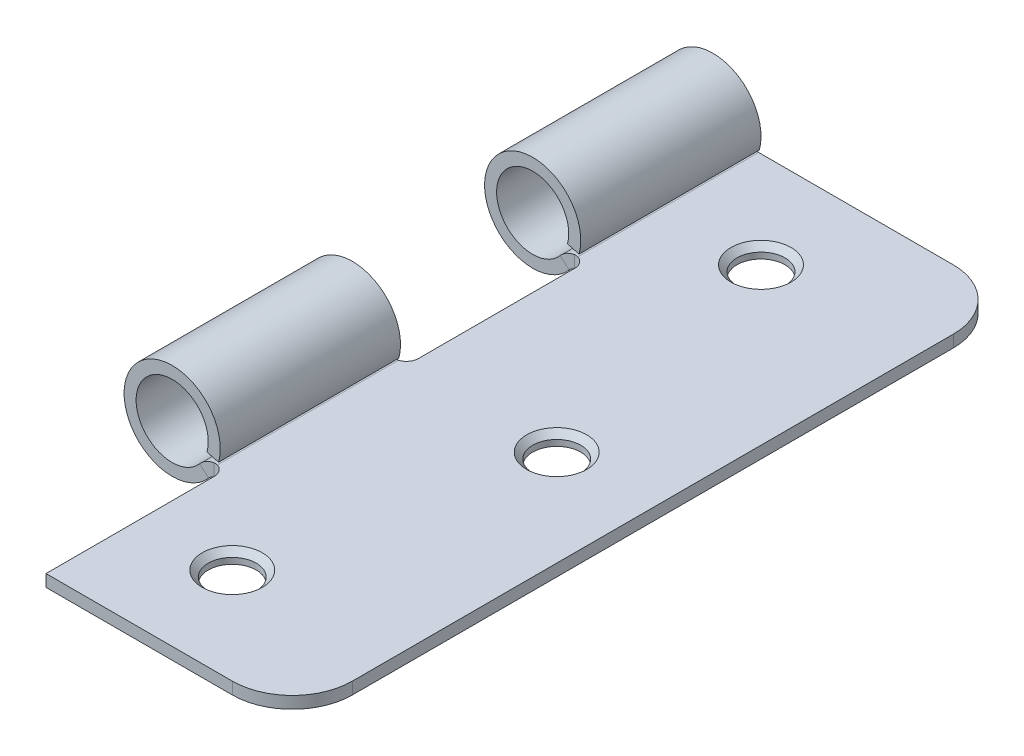
ISO-10303-21;
HEADER;
FILE_DESCRIPTION(('STEP AP214'),'2;1');
FILE_NAME('part.step','',(''),(''),'','','');
FILE_SCHEMA(('AUTOMOTIVE_DESIGN { 1 0 10303 214 1 1 1 1 }'));
ENDSEC;
DATA;
#1=APPLICATION_CONTEXT('core data for automotive mechanical design processes');
#2=APPLICATION_PROTOCOL_DEFINITION('international standard','automotive_design',2000,#1);
#3=PRODUCT_CONTEXT('',#1,'mechanical');
#4=PRODUCT('Part','Part','',(#3));
#5=PRODUCT_RELATED_PRODUCT_CATEGORY('part','',(#4));
#6=PRODUCT_DEFINITION_FORMATION('','',#4);
#7=PRODUCT_DEFINITION_CONTEXT('part definition',#1,'design');
#8=PRODUCT_DEFINITION('design','',#6,#7);
#9=PRODUCT_DEFINITION_SHAPE('','',#8);
#10=(LENGTH_UNIT() NAMED_UNIT(*) SI_UNIT(.MILLI.,.METRE.));
#11=(NAMED_UNIT(*) PLANE_ANGLE_UNIT() SI_UNIT($,.RADIAN.));
#12=(NAMED_UNIT(*) SI_UNIT($,.STERADIAN.) SOLID_ANGLE_UNIT());
#13=UNCERTAINTY_MEASURE_WITH_UNIT(LENGTH_MEASURE(1.E-05),#10,'distance_accuracy_value','');
#14=(GEOMETRIC_REPRESENTATION_CONTEXT(3) GLOBAL_UNCERTAINTY_ASSIGNED_CONTEXT((#13)) GLOBAL_UNIT_ASSIGNED_CONTEXT((#10,
#11,#12)) REPRESENTATION_CONTEXT('',''));
#15=CARTESIAN_POINT('',(0.,0.,0.));
#16=DIRECTION('',(0.,0.,1.));
#17=DIRECTION('',(1.,0.,0.));
#18=AXIS2_PLACEMENT_3D('',#15,#16,#17);
#19=CARTESIAN_POINT('',(-4.,4.,-15.));
#20=DIRECTION('',(0.,0.,-1.));
#21=DIRECTION('',(-1.,0.,0.));
#22=AXIS2_PLACEMENT_3D('',#19,#20,#21);
#23=PLANE('',#22);
#24=CARTESIAN_POINT('',(0.,0.,-15.));
#25=DIRECTION('',(0.,0.,-1.));
#26=DIRECTION('',(-1.,0.,0.));
#27=AXIS2_PLACEMENT_3D('',#24,#25,#26);
#28=CIRCLE('',#27,4.);
#29=CARTESIAN_POINT('',(3.03973683071413,-2.6,-15.));
#30=VERTEX_POINT('',#29);
#31=CARTESIAN_POINT('',(3.85972796968906,-1.05,-15.));
#32=VERTEX_POINT('',#31);
#33=EDGE_CURVE('E525',#30,#32,#28,.T.);
#34=ORIENTED_EDGE('',*,*,#33,.F.);
#35=DIRECTION('',(-0.759934207678533,0.65,0.));
#36=VECTOR('',#35,1.);
#37=CARTESIAN_POINT('',(3.03973683071413,-2.6,-15.));
#38=LINE('',#37,#36);
#39=CARTESIAN_POINT('',(2.2798026230356,-1.95,-15.));
#40=VERTEX_POINT('',#39);
#41=EDGE_CURVE('E290',#30,#40,#38,.T.);
#42=ORIENTED_EDGE('',*,*,#41,.T.);
#43=CARTESIAN_POINT('',(0.,0.,-15.));
#44=DIRECTION('',(0.,0.,-1.));
#45=DIRECTION('',(-1.,0.,0.));
#46=AXIS2_PLACEMENT_3D('',#43,#44,#45);
#47=CIRCLE('',#46,3.);
#48=CARTESIAN_POINT('',(2.89479597726679,-0.787500000000001,-15.));
#49=VERTEX_POINT('',#48);
#50=EDGE_CURVE('E474',#40,#49,#47,.T.);
#51=ORIENTED_EDGE('',*,*,#50,.T.);
#52=DIRECTION('',(0.964931992422264,-0.2625,0.));
#53=VECTOR('',#52,1.);
#54=CARTESIAN_POINT('',(3.85972796968906,-1.05,-15.));
#55=LINE('',#54,#53);
#56=EDGE_CURVE('E479',#49,#32,#55,.T.);
#57=ORIENTED_EDGE('',*,*,#56,.T.);
#58=EDGE_LOOP('',(#34,#42,#51,#57));
#59=FACE_BOUND('',#58,.T.);
#60=ADVANCED_FACE('F42',(#59),#23,.F.);
#61=CARTESIAN_POINT('',(-4.,4.,0.));
#62=DIRECTION('',(0.,0.,1.));
#63=DIRECTION('',(1.,0.,0.));
#64=AXIS2_PLACEMENT_3D('',#61,#62,#63);
#65=PLANE('',#64);
#66=CARTESIAN_POINT('',(0.,0.,0.));
#67=DIRECTION('',(0.,0.,1.));
#68=DIRECTION('',(1.,0.,0.));
#69=AXIS2_PLACEMENT_3D('',#66,#67,#68);
#70=CIRCLE('',#69,3.);
#71=CARTESIAN_POINT('',(2.89479597726679,-0.787500000000001,0.));
#72=VERTEX_POINT('',#71);
#73=CARTESIAN_POINT('',(2.2798026230356,-1.95,0.));
#74=VERTEX_POINT('',#73);
#75=EDGE_CURVE('E484',#72,#74,#70,.T.);
#76=ORIENTED_EDGE('',*,*,#75,.T.);
#77=DIRECTION('',(0.759934207678533,-0.650000000000001,0.));
#78=VECTOR('',#77,1.);
#79=CARTESIAN_POINT('',(2.2798026230356,-1.95,0.));
#80=LINE('',#79,#78);
#81=CARTESIAN_POINT('',(3.03973683071413,-2.6,0.));
#82=VERTEX_POINT('',#81);
#83=EDGE_CURVE('E288',#74,#82,#80,.T.);
#84=ORIENTED_EDGE('',*,*,#83,.T.);
#85=CARTESIAN_POINT('',(0.,0.,0.));
#86=DIRECTION('',(0.,0.,1.));
#87=DIRECTION('',(1.,0.,0.));
#88=AXIS2_PLACEMENT_3D('',#85,#86,#87);
#89=CIRCLE('',#88,4.);
#90=CARTESIAN_POINT('',(3.85972796968906,-1.05,0.));
#91=VERTEX_POINT('',#90);
#92=EDGE_CURVE('E473',#91,#82,#89,.T.);
#93=ORIENTED_EDGE('',*,*,#92,.F.);
#94=DIRECTION('',(-0.964931992422264,0.2625,0.));
#95=VECTOR('',#94,1.);
#96=CARTESIAN_POINT('',(3.85972796968906,-1.05,0.));
#97=LINE('',#96,#95);
#98=EDGE_CURVE('E477',#91,#72,#97,.T.);
#99=ORIENTED_EDGE('',*,*,#98,.T.);
#100=EDGE_LOOP('',(#76,#84,#93,#99));
#101=FACE_BOUND('',#100,.T.);
#102=ADVANCED_FACE('F440',(#101),#65,.F.);
#103=CARTESIAN_POINT('',(-4.,4.,15.));
#104=DIRECTION('',(0.,0.,-1.));
#105=DIRECTION('',(-1.,0.,0.));
#106=AXIS2_PLACEMENT_3D('',#103,#104,#105);
#107=PLANE('',#106);
#108=CARTESIAN_POINT('',(0.,0.,15.));
#109=DIRECTION('',(0.,0.,-1.));
#110=DIRECTION('',(-1.,0.,0.));
#111=AXIS2_PLACEMENT_3D('',#108,#109,#110);
#112=CIRCLE('',#111,4.);
#113=CARTESIAN_POINT('',(3.03973683071413,-2.6,15.));
#114=VERTEX_POINT('',#113);
#115=CARTESIAN_POINT('',(3.85972796968906,-1.05,15.));
#116=VERTEX_POINT('',#115);
#117=EDGE_CURVE('E514',#114,#116,#112,.T.);
#118=ORIENTED_EDGE('',*,*,#117,.F.);
#119=DIRECTION('',(-0.759934207678533,0.650000000000001,0.));
#120=VECTOR('',#119,1.);
#121=CARTESIAN_POINT('',(3.03973683071413,-2.6,15.));
#122=LINE('',#121,#120);
#123=CARTESIAN_POINT('',(2.2798026230356,-1.95,15.));
#124=VERTEX_POINT('',#123);
#125=EDGE_CURVE('E285',#114,#124,#122,.T.);
#126=ORIENTED_EDGE('',*,*,#125,.T.);
#127=CARTESIAN_POINT('',(0.,0.,15.));
#128=DIRECTION('',(0.,0.,-1.));
#129=DIRECTION('',(-1.,0.,0.));
#130=AXIS2_PLACEMENT_3D('',#127,#128,#129);
#131=CIRCLE('',#130,3.);
#132=CARTESIAN_POINT('',(2.89479597726679,-0.787500000000001,15.));
#133=VERTEX_POINT('',#132);
#134=EDGE_CURVE('E522',#124,#133,#131,.T.);
#135=ORIENTED_EDGE('',*,*,#134,.T.);
#136=DIRECTION('',(0.964931992422264,-0.2625,0.));
#137=VECTOR('',#136,1.);
#138=CARTESIAN_POINT('',(3.85972796968906,-1.05,15.));
#139=LINE('',#138,#137);
#140=EDGE_CURVE('E517',#133,#116,#139,.T.);
#141=ORIENTED_EDGE('',*,*,#140,.T.);
#142=EDGE_LOOP('',(#118,#126,#135,#141));
#143=FACE_BOUND('',#142,.T.);
#144=ADVANCED_FACE('F446',(#143),#107,.F.);
#145=CARTESIAN_POINT('',(3.79967103839267,-3.25,30.));
#146=DIRECTION('',(0.,0.,-1.));
#147=DIRECTION('',(-1.,0.,0.));
#148=AXIS2_PLACEMENT_3D('',#145,#146,#147);
#149=CYLINDRICAL_SURFACE('',#148,2.);
#150=CARTESIAN_POINT('',(3.79967103839267,-3.25,0.));
#151=DIRECTION('',(0.,0.,1.));
#152=DIRECTION('',(1.,0.,0.));
#153=AXIS2_PLACEMENT_3D('',#150,#151,#152);
#154=CIRCLE('',#153,2.);
#155=CARTESIAN_POINT('',(3.50000000000001,-1.27257812575347,0.));
#156=VERTEX_POINT('',#155);
#157=EDGE_CURVE('E487',#74,#156,#154,.F.);
#158=ORIENTED_EDGE('',*,*,#157,.F.);
#159=DIRECTION('',(0.,0.,-1.));
#160=VECTOR('',#159,1.);
#161=CARTESIAN_POINT('',(2.2798026230356,-1.95,30.));
#162=LINE('',#161,#160);
#163=EDGE_CURVE('E263',#124,#74,#162,.T.);
#164=ORIENTED_EDGE('',*,*,#163,.F.);
#165=CARTESIAN_POINT('',(3.79967103839267,-3.25,15.));
#166=DIRECTION('',(0.,0.,-1.));
#167=DIRECTION('',(-1.,0.,0.));
#168=AXIS2_PLACEMENT_3D('',#165,#166,#167);
#169=CIRCLE('',#168,2.);
#170=CARTESIAN_POINT('',(3.5,-1.27257812575347,15.));
#171=VERTEX_POINT('',#170);
#172=EDGE_CURVE('E511',#171,#124,#169,.F.);
#173=ORIENTED_EDGE('',*,*,#172,.F.);
#174=CARTESIAN_POINT('',(3.5,-1.27257812575347,15.));
#175=CARTESIAN_POINT('',(3.52525806966535,-1.26874628469074,14.9999961626462));
#176=CARTESIAN_POINT('',(3.55059157931103,-1.26540623348809,15.0009569814927));
#177=CARTESIAN_POINT('',(3.60104085996858,-1.25972821267769,15.0047993866077));
#178=CARTESIAN_POINT('',(3.62615689453804,-1.2573832611068,15.0076672149353));
#179=CARTESIAN_POINT('',(3.67616848193919,-1.25365934632331,15.0153149888024));
#180=CARTESIAN_POINT('',(3.70106403482151,-1.25228038288891,15.0200949339029));
#181=CARTESIAN_POINT('',(3.75063082715903,-1.25044549787901,15.0315796795409));
#182=CARTESIAN_POINT('',(3.7752991674899,-1.24999628314065,15.038298070478));
#183=CARTESIAN_POINT('',(3.79967103839267,-1.25,15.045957407267));
#184=B_SPLINE_CURVE_WITH_KNOTS('',3,(#174,#175,#176,#177,#178,#179,#180,#181,#182,#183),
.UNSPECIFIED.,.F.,.F.,(4,2,2,2,4),(0.,0.0766195222768499,0.152692191899362,0.228764844054566,
0.305384368144875),.UNSPECIFIED.);
#185=CARTESIAN_POINT('',(3.79967103839267,-1.25,15.0459574072667));
#186=VERTEX_POINT('',#185);
#187=EDGE_CURVE('E318',#171,#186,#184,.T.);
#188=ORIENTED_EDGE('',*,*,#187,.T.);
#189=DIRECTION('',(0.,0.,-1.));
#190=VECTOR('',#189,1.);
#191=CARTESIAN_POINT('',(3.79967103839267,-1.25,30.));
#192=LINE('',#191,#190);
#193=CARTESIAN_POINT('',(3.79967103839267,-1.25,-0.045957407266678));
#194=VERTEX_POINT('',#193);
#195=EDGE_CURVE('E266',#186,#194,#192,.T.);
#196=ORIENTED_EDGE('',*,*,#195,.T.);
#197=CARTESIAN_POINT('',(3.79967103839267,-1.25,-0.0459574072666771));
#198=CARTESIAN_POINT('',(3.77529916748986,-1.24999628314065,-0.0382980704778374));
#199=CARTESIAN_POINT('',(3.75063082715897,-1.25044549787902,-0.031579679540831));
#200=CARTESIAN_POINT('',(3.70106403482146,-1.25228038288891,-0.0200949339028791));
#201=CARTESIAN_POINT('',(3.67616848193916,-1.25365934632331,-0.0153149888023927));
#202=CARTESIAN_POINT('',(3.62615689453802,-1.2573832611068,-0.00766721493527763));
#203=CARTESIAN_POINT('',(3.60104085996856,-1.25972821267769,-0.00479938660769741));
#204=CARTESIAN_POINT('',(3.55059157931102,-1.2654062334881,-0.000956981492719929));
#205=CARTESIAN_POINT('',(3.52525806966535,-1.26874628469074,3.83735374171621E-06));
#206=CARTESIAN_POINT('',(3.50000000000001,-1.27257812575347,0.));
#207=B_SPLINE_CURVE_WITH_KNOTS('',3,(#197,#198,#199,#200,#201,#202,#203,#204,#205,#206),
.UNSPECIFIED.,.F.,.F.,(4,2,2,2,4),(0.,0.0766195240902687,0.152692176245446,0.228764845867951,
0.30538436814478),.UNSPECIFIED.);
#208=EDGE_CURVE('E356',#194,#156,#207,.T.);
#209=ORIENTED_EDGE('',*,*,#208,.T.);
#210=EDGE_LOOP('',(#158,#164,#173,#188,#196,#209));
#211=FACE_BOUND('',#210,.T.);
#212=ADVANCED_FACE('F373',(#211),#149,.T.);
#213=CARTESIAN_POINT('',(0.,0.,30.));
#214=DIRECTION('',(0.,0.,-1.));
#215=DIRECTION('',(-1.,0.,0.));
#216=AXIS2_PLACEMENT_3D('',#213,#214,#215);
#217=CYLINDRICAL_SURFACE('',#216,3.);
#218=ORIENTED_EDGE('',*,*,#75,.F.);
#219=DIRECTION('',(0.,0.,-1.));
#220=VECTOR('',#219,1.);
#221=CARTESIAN_POINT('',(2.89479597726679,-0.787500000000001,30.));
#222=LINE('',#221,#220);
#223=EDGE_CURVE('E260',#133,#72,#222,.T.);
#224=ORIENTED_EDGE('',*,*,#223,.F.);
#225=ORIENTED_EDGE('',*,*,#134,.F.);
#226=ORIENTED_EDGE('',*,*,#163,.T.);
#227=EDGE_LOOP('',(#218,#224,#225,#226));
#228=FACE_BOUND('',#227,.T.);
#229=ADVANCED_FACE('F667',(#228),#217,.F.);
#230=CARTESIAN_POINT('',(3.85972796968906,-1.05,30.));
#231=DIRECTION('',(-0.2625,-0.964931992422264,0.));
#232=DIRECTION('',(0.964931992422264,-0.2625,0.));
#233=AXIS2_PLACEMENT_3D('',#230,#231,#232);
#234=PLANE('',#233);
#235=ORIENTED_EDGE('',*,*,#98,.F.);
#236=DIRECTION('',(0.,0.,-1.));
#237=VECTOR('',#236,1.);
#238=CARTESIAN_POINT('',(3.85972796968906,-1.05,30.));
#239=LINE('',#238,#237);
#240=EDGE_CURVE('E257',#116,#91,#239,.T.);
#241=ORIENTED_EDGE('',*,*,#240,.F.);
#242=ORIENTED_EDGE('',*,*,#140,.F.);
#243=ORIENTED_EDGE('',*,*,#223,.T.);
#244=EDGE_LOOP('',(#235,#241,#242,#243));
#245=FACE_BOUND('',#244,.T.);
#246=ADVANCED_FACE('F677',(#245),#234,.T.);
#247=CARTESIAN_POINT('',(0.,0.,30.));
#248=DIRECTION('',(0.,0.,-1.));
#249=DIRECTION('',(-1.,0.,0.));
#250=AXIS2_PLACEMENT_3D('',#247,#248,#249);
#251=CYLINDRICAL_SURFACE('',#250,4.);
#252=DIRECTION('',(0.,0.,-1.));
#253=VECTOR('',#252,1.);
#254=CARTESIAN_POINT('',(3.03973683071413,-2.6,30.));
#255=LINE('',#254,#253);
#256=CARTESIAN_POINT('',(3.03973683071413,-2.6,-30.));
#257=VERTEX_POINT('',#256);
#258=EDGE_CURVE('E252',#30,#257,#255,.T.);
#259=ORIENTED_EDGE('',*,*,#258,.F.);
#260=ORIENTED_EDGE('',*,*,#33,.T.);
#261=CARTESIAN_POINT('',(3.85972796968906,-1.05,-30.));
#262=VERTEX_POINT('',#261);
#263=EDGE_CURVE('E255',#32,#262,#239,.T.);
#264=ORIENTED_EDGE('',*,*,#263,.T.);
#265=CARTESIAN_POINT('',(0.,0.,-30.));
#266=DIRECTION('',(0.,0.,1.));
#267=DIRECTION('',(1.,0.,0.));
#268=AXIS2_PLACEMENT_3D('',#265,#266,#267);
#269=CIRCLE('',#268,4.);
#270=EDGE_CURVE('E247',#262,#257,#269,.T.);
#271=ORIENTED_EDGE('',*,*,#270,.T.);
#272=EDGE_LOOP('',(#259,#260,#264,#271));
#273=FACE_BOUND('',#272,.T.);
#274=ADVANCED_FACE('F534',(#273),#251,.T.);
#275=ORIENTED_EDGE('',*,*,#240,.T.);
#276=ORIENTED_EDGE('',*,*,#92,.T.);
#277=EDGE_CURVE('E254',#114,#82,#255,.T.);
#278=ORIENTED_EDGE('',*,*,#277,.F.);
#279=ORIENTED_EDGE('',*,*,#117,.T.);
#280=EDGE_LOOP('',(#275,#276,#278,#279));
#281=FACE_BOUND('',#280,.T.);
#282=ADVANCED_FACE('F655',(#281),#251,.T.);
#283=CARTESIAN_POINT('',(3.79967103839267,-3.25,30.));
#284=DIRECTION('',(0.,0.,-1.));
#285=DIRECTION('',(-1.,0.,0.));
#286=AXIS2_PLACEMENT_3D('',#283,#284,#285);
#287=CYLINDRICAL_SURFACE('',#286,1.);
#288=ORIENTED_EDGE('',*,*,#277,.T.);
#289=CARTESIAN_POINT('',(3.79967103839267,-3.25,0.));
#290=DIRECTION('',(0.,0.,1.));
#291=DIRECTION('',(1.,0.,0.));
#292=AXIS2_PLACEMENT_3D('',#289,#290,#291);
#293=CIRCLE('',#292,1.);
#294=CARTESIAN_POINT('',(3.50000000000001,-2.29595740726702,0.));
#295=VERTEX_POINT('',#294);
#296=EDGE_CURVE('E279',#82,#295,#293,.F.);
#297=ORIENTED_EDGE('',*,*,#296,.T.);
#298=CARTESIAN_POINT('',(3.50000000000001,-2.29595740726702,0.));
#299=CARTESIAN_POINT('',(3.51957914919401,-2.28980655121241,5.89914558545269E-07));
#300=CARTESIAN_POINT('',(3.53933698416749,-2.28426454209161,-0.000576001277334713));
#301=CARTESIAN_POINT('',(3.57909764557699,-2.27441425109873,-0.00293376845682965));
#302=CARTESIAN_POINT('',(3.59910059644118,-2.27010662539284,-0.00471558342530537));
#303=CARTESIAN_POINT('',(3.65851730173643,-2.25920755965835,-0.0118521737425471));
#304=CARTESIAN_POINT('',(3.69809004691073,-2.25440637226324,-0.0189951866346676));
#305=CARTESIAN_POINT('',(3.74762406736527,-2.25129937223126,-0.0310829325965476));
#306=CARTESIAN_POINT('',(3.75806356134268,-2.2508114116661,-0.0338113479703317));
#307=CARTESIAN_POINT('',(3.77890856064359,-2.25016132900707,-0.0396215145788455));
#308=CARTESIAN_POINT('',(3.78931365697017,-2.25000079525633,-0.0427049119001406));
#309=CARTESIAN_POINT('',(3.79967103839259,-2.25,-0.0459574072669965));
#310=B_SPLINE_CURVE_WITH_KNOTS('',3,(#298,#299,#300,#301,#302,#303,#304,#305,#306,#307,#308,
#309),.UNSPECIFIED.,.F.,.F.,(4,2,2,2,2,4),(0.,0.061524461135212,0.123081566664696,
0.243864969400355,0.276263286736285,0.308818397634519),.UNSPECIFIED.);
#311=CARTESIAN_POINT('',(3.79967103839267,-2.25,-0.045957407266678));
#312=VERTEX_POINT('',#311);
#313=EDGE_CURVE('E349',#295,#312,#310,.T.);
#314=ORIENTED_EDGE('',*,*,#313,.T.);
#315=DIRECTION('',(0.,0.,-1.));
#316=VECTOR('',#315,1.);
#317=CARTESIAN_POINT('',(3.79967103839267,-2.25,30.));
#318=LINE('',#317,#316);
#319=CARTESIAN_POINT('',(3.79967103839267,-2.25,15.0459574072667));
#320=VERTEX_POINT('',#319);
#321=EDGE_CURVE('E225',#320,#312,#318,.T.);
#322=ORIENTED_EDGE('',*,*,#321,.F.);
#323=CARTESIAN_POINT('',(3.79967103839267,-2.25,15.0459574072667));
#324=CARTESIAN_POINT('',(3.78009188919861,-2.24999941008544,15.0398065512123));
#325=CARTESIAN_POINT('',(3.76033405422512,-2.25057600127734,15.0342645420916));
#326=CARTESIAN_POINT('',(3.72057339281561,-2.25293376845683,15.0244142510987));
#327=CARTESIAN_POINT('',(3.70057044195144,-2.25471558342531,15.0201066253928));
#328=CARTESIAN_POINT('',(3.6411537366562,-2.26185217374256,15.0092075596583));
#329=CARTESIAN_POINT('',(3.6015809914819,-2.26899518663468,15.0044063722632));
#330=CARTESIAN_POINT('',(3.55204697102735,-2.28108293259656,15.0012993722313));
#331=CARTESIAN_POINT('',(3.54160747704994,-2.28381134797035,15.0008114116661));
#332=CARTESIAN_POINT('',(3.52076247774902,-2.28962151457887,15.0001613290071));
#333=CARTESIAN_POINT('',(3.51035738142242,-2.29270491190016,15.0000007952563));
#334=CARTESIAN_POINT('',(3.5,-2.29595740726702,15.));
#335=B_SPLINE_CURVE_WITH_KNOTS('',3,(#323,#324,#325,#326,#327,#328,#329,#330,#331,#332,#333,
#334),.UNSPECIFIED.,.F.,.F.,(4,2,2,2,2,4),(0.,0.0615244611351867,0.123081566664655,
0.243864969400304,0.276263286736258,0.308818397634512),.UNSPECIFIED.);
#336=CARTESIAN_POINT('',(3.5,-2.29595740726702,15.));
#337=VERTEX_POINT('',#336);
#338=EDGE_CURVE('E310',#320,#337,#335,.T.);
#339=ORIENTED_EDGE('',*,*,#338,.T.);
#340=CARTESIAN_POINT('',(3.79967103839267,-3.25,15.));
#341=DIRECTION('',(0.,0.,-1.));
#342=DIRECTION('',(-1.,0.,0.));
#343=AXIS2_PLACEMENT_3D('',#340,#341,#342);
#344=CIRCLE('',#343,1.);
#345=EDGE_CURVE('E210',#337,#114,#344,.F.);
#346=ORIENTED_EDGE('',*,*,#345,.T.);
#347=EDGE_LOOP('',(#288,#297,#314,#322,#339,#346));
#348=FACE_BOUND('',#347,.T.);
#349=ADVANCED_FACE('F631',(#348),#287,.F.);
#350=CARTESIAN_POINT('',(3.79967103839267,-2.25,-30.));
#351=DIRECTION('',(0.,0.,-1.));
#352=DIRECTION('',(-1.,0.,0.));
#353=AXIS2_PLACEMENT_3D('',#350,#351,#352);
#354=PLANE('',#353);
#355=DIRECTION('',(0.,1.,0.));
#356=VECTOR('',#355,1.);
#357=CARTESIAN_POINT('',(3.79967103839267,-2.25,-30.));
#358=LINE('',#357,#356);
#359=CARTESIAN_POINT('',(3.79967103839267,-2.25,-30.));
#360=VERTEX_POINT('',#359);
#361=CARTESIAN_POINT('',(3.79967103839267,-1.25,-30.));
#362=VERTEX_POINT('',#361);
#363=EDGE_CURVE('E211',#360,#362,#358,.T.);
#364=ORIENTED_EDGE('',*,*,#363,.F.);
#365=CARTESIAN_POINT('',(3.79967103839267,-3.25,-30.));
#366=DIRECTION('',(0.,0.,1.));
#367=DIRECTION('',(1.,0.,0.));
#368=AXIS2_PLACEMENT_3D('',#365,#366,#367);
#369=CIRCLE('',#368,1.);
#370=EDGE_CURVE('E227',#257,#360,#369,.F.);
#371=ORIENTED_EDGE('',*,*,#370,.F.);
#372=DIRECTION('',(0.759934207678533,-0.65,0.));
#373=VECTOR('',#372,1.);
#374=CARTESIAN_POINT('',(2.2798026230356,-1.95,-30.));
#375=LINE('',#374,#373);
#376=CARTESIAN_POINT('',(2.2798026230356,-1.95,-30.));
#377=VERTEX_POINT('',#376);
#378=EDGE_CURVE('E271',#377,#257,#375,.T.);
#379=ORIENTED_EDGE('',*,*,#378,.F.);
#380=CARTESIAN_POINT('',(3.79967103839267,-3.25,-30.));
#381=DIRECTION('',(0.,0.,1.));
#382=DIRECTION('',(1.,0.,0.));
#383=AXIS2_PLACEMENT_3D('',#380,#381,#382);
#384=CIRCLE('',#383,2.);
#385=EDGE_CURVE('E238',#377,#362,#384,.F.);
#386=ORIENTED_EDGE('',*,*,#385,.T.);
#387=EDGE_LOOP('',(#364,#371,#379,#386));
#388=FACE_BOUND('',#387,.T.);
#389=ADVANCED_FACE('F337',(#388),#354,.T.);
#390=CARTESIAN_POINT('',(2.2798026230356,-1.95,-30.));
#391=DIRECTION('',(0.,0.,-1.));
#392=DIRECTION('',(-1.,0.,0.));
#393=AXIS2_PLACEMENT_3D('',#390,#391,#392);
#394=PLANE('',#393);
#395=DIRECTION('',(1.,0.,0.));
#396=VECTOR('',#395,1.);
#397=CARTESIAN_POINT('',(3.30718913883074,-1.25,-30.));
#398=LINE('',#397,#396);
#399=CARTESIAN_POINT('',(20.,-1.25,-30.));
#400=VERTEX_POINT('',#399);
#401=EDGE_CURVE('E234',#362,#400,#398,.T.);
#402=ORIENTED_EDGE('',*,*,#401,.T.);
#403=DIRECTION('',(0.,-1.,0.));
#404=VECTOR('',#403,1.);
#405=CARTESIAN_POINT('',(20.,-1.95,-30.));
#406=LINE('',#405,#404);
#407=CARTESIAN_POINT('',(20.,-2.25,-30.));
#408=VERTEX_POINT('',#407);
#409=EDGE_CURVE('E393',#400,#408,#406,.T.);
#410=ORIENTED_EDGE('',*,*,#409,.T.);
#411=DIRECTION('',(1.,0.,0.));
#412=VECTOR('',#411,1.);
#413=CARTESIAN_POINT('',(3.30718913883074,-2.25,-30.));
#414=LINE('',#413,#412);
#415=EDGE_CURVE('E231',#360,#408,#414,.T.);
#416=ORIENTED_EDGE('',*,*,#415,.F.);
#417=ORIENTED_EDGE('',*,*,#363,.T.);
#418=EDGE_LOOP('',(#402,#410,#416,#417));
#419=FACE_BOUND('',#418,.T.);
#420=ADVANCED_FACE('F547',(#419),#394,.T.);
#421=CARTESIAN_POINT('',(3.30718913883074,-2.25,30.));
#422=DIRECTION('',(0.,1.,0.));
#423=DIRECTION('',(0.,0.,1.));
#424=AXIS2_PLACEMENT_3D('',#421,#422,#423);
#425=PLANE('',#424);
#426=CARTESIAN_POINT('',(12.,-2.25,-22.));
#427=DIRECTION('',(0.,1.,0.));
#428=DIRECTION('',(0.,0.,1.));
#429=AXIS2_PLACEMENT_3D('',#426,#427,#428);
#430=CIRCLE('',#429,2.00000000000001);
#431=CARTESIAN_POINT('',(12.,-2.25,-20.));
#432=VERTEX_POINT('',#431);
#433=EDGE_CURVE('E219',#432,#432,#430,.F.);
#434=ORIENTED_EDGE('',*,*,#433,.F.);
#435=EDGE_LOOP('',(#434));
#436=FACE_BOUND('',#435,.T.);
#437=CARTESIAN_POINT('',(12.,-2.25,22.));
#438=DIRECTION('',(0.,1.,0.));
#439=DIRECTION('',(0.,0.,1.));
#440=AXIS2_PLACEMENT_3D('',#437,#438,#439);
#441=CIRCLE('',#440,2.00000000000001);
#442=CARTESIAN_POINT('',(12.,-2.25,24.));
#443=VERTEX_POINT('',#442);
#444=EDGE_CURVE('E829',#443,#443,#441,.F.);
#445=ORIENTED_EDGE('',*,*,#444,.F.);
#446=EDGE_LOOP('',(#445));
#447=FACE_BOUND('',#446,.T.);
#448=CARTESIAN_POINT('',(17.,-2.25,0.));
#449=DIRECTION('',(0.,1.,0.));
#450=DIRECTION('',(0.,0.,1.));
#451=AXIS2_PLACEMENT_3D('',#448,#449,#450);
#452=CIRCLE('',#451,2.);
#453=CARTESIAN_POINT('',(17.,-2.25,2.));
#454=VERTEX_POINT('',#453);
#455=EDGE_CURVE('E832',#454,#454,#452,.F.);
#456=ORIENTED_EDGE('',*,*,#455,.F.);
#457=EDGE_LOOP('',(#456));
#458=FACE_BOUND('',#457,.T.);
#459=ORIENTED_EDGE('',*,*,#415,.T.);
#460=CARTESIAN_POINT('',(20.,-2.25,-25.));
#461=DIRECTION('',(0.,1.,0.));
#462=DIRECTION('',(0.,0.,1.));
#463=AXIS2_PLACEMENT_3D('',#460,#461,#462);
#464=CIRCLE('',#463,5.);
#465=CARTESIAN_POINT('',(25.,-2.25,-25.));
#466=VERTEX_POINT('',#465);
#467=EDGE_CURVE('E398',#408,#466,#464,.F.);
#468=ORIENTED_EDGE('',*,*,#467,.T.);
#469=DIRECTION('',(0.,0.,-1.));
#470=VECTOR('',#469,1.);
#471=CARTESIAN_POINT('',(25.,-2.25,30.));
#472=LINE('',#471,#470);
#473=CARTESIAN_POINT('',(25.,-2.25,25.));
#474=VERTEX_POINT('',#473);
#475=EDGE_CURVE('E269',#474,#466,#472,.T.);
#476=ORIENTED_EDGE('',*,*,#475,.F.);
#477=CARTESIAN_POINT('',(20.,-2.25,25.));
#478=DIRECTION('',(0.,1.,0.));
#479=DIRECTION('',(0.,0.,1.));
#480=AXIS2_PLACEMENT_3D('',#477,#478,#479);
#481=CIRCLE('',#480,5.);
#482=CARTESIAN_POINT('',(20.,-2.25,30.));
#483=VERTEX_POINT('',#482);
#484=EDGE_CURVE('E396',#474,#483,#481,.F.);
#485=ORIENTED_EDGE('',*,*,#484,.T.);
#486=DIRECTION('',(1.,0.,0.));
#487=VECTOR('',#486,1.);
#488=CARTESIAN_POINT('',(3.30718913883074,-2.25,30.));
#489=LINE('',#488,#487);
#490=CARTESIAN_POINT('',(4.5,-2.25,30.));
#491=VERTEX_POINT('',#490);
#492=EDGE_CURVE('E223',#491,#483,#489,.T.);
#493=ORIENTED_EDGE('',*,*,#492,.F.);
#494=DIRECTION('',(0.,0.,-1.));
#495=VECTOR('',#494,1.);
#496=CARTESIAN_POINT('',(4.5,-2.25,30.));
#497=LINE('',#496,#495);
#498=CARTESIAN_POINT('',(4.5,-2.25,16.));
#499=VERTEX_POINT('',#498);
#500=EDGE_CURVE('E208',#491,#499,#497,.T.);
#501=ORIENTED_EDGE('',*,*,#500,.T.);
#502=CARTESIAN_POINT('',(3.5,-2.25,16.));
#503=DIRECTION('',(0.,1.,0.));
#504=DIRECTION('',(0.,0.,1.));
#505=AXIS2_PLACEMENT_3D('',#502,#503,#504);
#506=CIRCLE('',#505,1.);
#507=EDGE_CURVE('E307',#499,#320,#506,.T.);
#508=ORIENTED_EDGE('',*,*,#507,.T.);
#509=ORIENTED_EDGE('',*,*,#321,.T.);
#510=CARTESIAN_POINT('',(3.50000000000001,-2.25,-1.));
#511=DIRECTION('',(0.,1.,0.));
#512=DIRECTION('',(0.,0.,1.));
#513=AXIS2_PLACEMENT_3D('',#510,#511,#512);
#514=CIRCLE('',#513,1.);
#515=CARTESIAN_POINT('',(4.50000000000001,-2.25,-1.));
#516=VERTEX_POINT('',#515);
#517=EDGE_CURVE('E495',#312,#516,#514,.T.);
#518=ORIENTED_EDGE('',*,*,#517,.T.);
#519=DIRECTION('',(0.,0.,-1.));
#520=VECTOR('',#519,1.);
#521=CARTESIAN_POINT('',(4.50000000000001,-2.25,30.));
#522=LINE('',#521,#520);
#523=CARTESIAN_POINT('',(4.50000000000001,-2.25,-14.));
#524=VERTEX_POINT('',#523);
#525=EDGE_CURVE('E235',#516,#524,#522,.T.);
#526=ORIENTED_EDGE('',*,*,#525,.T.);
#527=CARTESIAN_POINT('',(3.50000000000001,-2.25,-14.));
#528=DIRECTION('',(0.,1.,0.));
#529=DIRECTION('',(0.,0.,1.));
#530=AXIS2_PLACEMENT_3D('',#527,#528,#529);
#531=CIRCLE('',#530,1.);
#532=CARTESIAN_POINT('',(3.79967103839267,-2.25,-14.9540425927333));
#533=VERTEX_POINT('',#532);
#534=EDGE_CURVE('E363',#524,#533,#531,.T.);
#535=ORIENTED_EDGE('',*,*,#534,.T.);
#536=EDGE_CURVE('E222',#533,#360,#318,.T.);
#537=ORIENTED_EDGE('',*,*,#536,.T.);
#538=EDGE_LOOP('',(#459,#468,#476,#485,#493,#501,#508,#509,#518,#526,#535,#537));
#539=FACE_BOUND('',#538,.T.);
#540=ADVANCED_FACE('F493',(#436,#447,#458,#539),#425,.F.);
#541=CARTESIAN_POINT('',(25.,-1.25,30.));
#542=DIRECTION('',(1.,0.,0.));
#543=DIRECTION('',(0.,0.,-1.));
#544=AXIS2_PLACEMENT_3D('',#541,#542,#543);
#545=PLANE('',#544);
#546=ORIENTED_EDGE('',*,*,#475,.T.);
#547=DIRECTION('',(0.,-1.,0.));
#548=VECTOR('',#547,1.);
#549=CARTESIAN_POINT('',(25.,-1.25,-25.));
#550=LINE('',#549,#548);
#551=CARTESIAN_POINT('',(25.,-1.25,-25.));
#552=VERTEX_POINT('',#551);
#553=EDGE_CURVE('E65',#466,#552,#550,.F.);
#554=ORIENTED_EDGE('',*,*,#553,.T.);
#555=DIRECTION('',(0.,0.,-1.));
#556=VECTOR('',#555,1.);
#557=CARTESIAN_POINT('',(25.,-1.25,30.));
#558=LINE('',#557,#556);
#559=CARTESIAN_POINT('',(25.,-1.25,25.));
#560=VERTEX_POINT('',#559);
#561=EDGE_CURVE('E267',#560,#552,#558,.T.);
#562=ORIENTED_EDGE('',*,*,#561,.F.);
#563=DIRECTION('',(0.,-1.,0.));
#564=VECTOR('',#563,1.);
#565=CARTESIAN_POINT('',(25.,-1.25,25.));
#566=LINE('',#565,#564);
#567=EDGE_CURVE('E400',#560,#474,#566,.T.);
#568=ORIENTED_EDGE('',*,*,#567,.T.);
#569=EDGE_LOOP('',(#546,#554,#562,#568));
#570=FACE_BOUND('',#569,.T.);
#571=ADVANCED_FACE('F552',(#570),#545,.T.);
#572=CARTESIAN_POINT('',(3.30718913883074,-1.25,30.));
#573=DIRECTION('',(0.,1.,0.));
#574=DIRECTION('',(0.,0.,1.));
#575=AXIS2_PLACEMENT_3D('',#572,#573,#574);
#576=PLANE('',#575);
#577=CARTESIAN_POINT('',(17.,-1.25,0.));
#578=DIRECTION('',(0.,1.,0.));
#579=DIRECTION('',(0.,0.,1.));
#580=AXIS2_PLACEMENT_3D('',#577,#578,#579);
#581=CIRCLE('',#580,2.5);
#582=CARTESIAN_POINT('',(17.,-1.25,2.5));
#583=VERTEX_POINT('',#582);
#584=EDGE_CURVE('E418',#583,#583,#581,.F.);
#585=ORIENTED_EDGE('',*,*,#584,.T.);
#586=EDGE_LOOP('',(#585));
#587=FACE_BOUND('',#586,.T.);
#588=CARTESIAN_POINT('',(12.,-1.25,22.));
#589=DIRECTION('',(0.,1.,0.));
#590=DIRECTION('',(0.,0.,1.));
#591=AXIS2_PLACEMENT_3D('',#588,#589,#590);
#592=CIRCLE('',#591,2.50000000000002);
#593=CARTESIAN_POINT('',(12.,-1.25,24.5));
#594=VERTEX_POINT('',#593);
#595=EDGE_CURVE('E415',#594,#594,#592,.F.);
#596=ORIENTED_EDGE('',*,*,#595,.T.);
#597=EDGE_LOOP('',(#596));
#598=FACE_BOUND('',#597,.T.);
#599=CARTESIAN_POINT('',(12.,-1.25,-22.));
#600=DIRECTION('',(0.,1.,0.));
#601=DIRECTION('',(0.,0.,1.));
#602=AXIS2_PLACEMENT_3D('',#599,#600,#601);
#603=CIRCLE('',#602,2.5);
#604=CARTESIAN_POINT('',(12.,-1.25,-19.5));
#605=VERTEX_POINT('',#604);
#606=EDGE_CURVE('E412',#605,#605,#603,.F.);
#607=ORIENTED_EDGE('',*,*,#606,.T.);
#608=EDGE_LOOP('',(#607));
#609=FACE_BOUND('',#608,.T.);
#610=ORIENTED_EDGE('',*,*,#561,.T.);
#611=CARTESIAN_POINT('',(20.,-1.25,-25.));
#612=DIRECTION('',(0.,1.,0.));
#613=DIRECTION('',(0.,0.,1.));
#614=AXIS2_PLACEMENT_3D('',#611,#612,#613);
#615=CIRCLE('',#614,5.);
#616=EDGE_CURVE('E406',#552,#400,#615,.T.);
#617=ORIENTED_EDGE('',*,*,#616,.T.);
#618=ORIENTED_EDGE('',*,*,#401,.F.);
#619=CARTESIAN_POINT('',(3.79967103839267,-1.25,-14.9540425927333));
#620=VERTEX_POINT('',#619);
#621=EDGE_CURVE('E264',#620,#362,#192,.T.);
#622=ORIENTED_EDGE('',*,*,#621,.F.);
#623=CARTESIAN_POINT('',(3.50000000000001,-1.25,-14.));
#624=DIRECTION('',(0.,1.,0.));
#625=DIRECTION('',(0.,0.,1.));
#626=AXIS2_PLACEMENT_3D('',#623,#624,#625);
#627=CIRCLE('',#626,1.);
#628=CARTESIAN_POINT('',(4.50000000000001,-1.25,-14.));
#629=VERTEX_POINT('',#628);
#630=EDGE_CURVE('E386',#620,#629,#627,.F.);
#631=ORIENTED_EDGE('',*,*,#630,.T.);
#632=DIRECTION('',(0.,0.,-1.));
#633=VECTOR('',#632,1.);
#634=CARTESIAN_POINT('',(4.50000000000001,-1.25,30.));
#635=LINE('',#634,#633);
#636=CARTESIAN_POINT('',(4.50000000000001,-1.25,-1.));
#637=VERTEX_POINT('',#636);
#638=EDGE_CURVE('E282',#637,#629,#635,.T.);
#639=ORIENTED_EDGE('',*,*,#638,.F.);
#640=CARTESIAN_POINT('',(3.50000000000001,-1.25,-1.));
#641=DIRECTION('',(0.,1.,0.));
#642=DIRECTION('',(0.,0.,1.));
#643=AXIS2_PLACEMENT_3D('',#640,#641,#642);
#644=CIRCLE('',#643,1.);
#645=EDGE_CURVE('E364',#637,#194,#644,.F.);
#646=ORIENTED_EDGE('',*,*,#645,.T.);
#647=ORIENTED_EDGE('',*,*,#195,.F.);
#648=CARTESIAN_POINT('',(3.5,-1.25,16.));
#649=DIRECTION('',(0.,1.,0.));
#650=DIRECTION('',(0.,0.,1.));
#651=AXIS2_PLACEMENT_3D('',#648,#649,#650);
#652=CIRCLE('',#651,1.);
#653=CARTESIAN_POINT('',(4.5,-1.25,16.));
#654=VERTEX_POINT('',#653);
#655=EDGE_CURVE('E218',#186,#654,#652,.F.);
#656=ORIENTED_EDGE('',*,*,#655,.T.);
#657=DIRECTION('',(0.,0.,-1.));
#658=VECTOR('',#657,1.);
#659=CARTESIAN_POINT('',(4.5,-1.25,30.));
#660=LINE('',#659,#658);
#661=CARTESIAN_POINT('',(4.5,-1.25,30.));
#662=VERTEX_POINT('',#661);
#663=EDGE_CURVE('E205',#662,#654,#660,.T.);
#664=ORIENTED_EDGE('',*,*,#663,.F.);
#665=DIRECTION('',(1.,0.,0.));
#666=VECTOR('',#665,1.);
#667=CARTESIAN_POINT('',(3.30718913883074,-1.25,30.));
#668=LINE('',#667,#666);
#669=CARTESIAN_POINT('',(20.,-1.25,30.));
#670=VERTEX_POINT('',#669);
#671=EDGE_CURVE('E215',#662,#670,#668,.T.);
#672=ORIENTED_EDGE('',*,*,#671,.T.);
#673=CARTESIAN_POINT('',(20.,-1.25,25.));
#674=DIRECTION('',(0.,1.,0.));
#675=DIRECTION('',(0.,0.,1.));
#676=AXIS2_PLACEMENT_3D('',#673,#674,#675);
#677=CIRCLE('',#676,5.);
#678=EDGE_CURVE('E404',#670,#560,#677,.T.);
#679=ORIENTED_EDGE('',*,*,#678,.T.);
#680=EDGE_LOOP('',(#610,#617,#618,#622,#631,#639,#646,#647,#656,#664,#672,#679));
#681=FACE_BOUND('',#680,.T.);
#682=ADVANCED_FACE('F214',(#587,#598,#609,#681),#576,.T.);
#683=CARTESIAN_POINT('',(3.79967103839267,-3.25,-15.));
#684=DIRECTION('',(0.,0.,-1.));
#685=DIRECTION('',(-1.,0.,0.));
#686=AXIS2_PLACEMENT_3D('',#683,#684,#685);
#687=CIRCLE('',#686,2.);
#688=CARTESIAN_POINT('',(3.50000000000001,-1.27257812575347,-15.));
#689=VERTEX_POINT('',#688);
#690=EDGE_CURVE('E472',#689,#40,#687,.F.);
#691=ORIENTED_EDGE('',*,*,#690,.F.);
#692=CARTESIAN_POINT('',(3.50000000000001,-1.27257812575347,-15.));
#693=CARTESIAN_POINT('',(3.52525806966535,-1.26874628469074,-15.0000038373537));
#694=CARTESIAN_POINT('',(3.55059157931103,-1.26540623348809,-14.9990430185073));
#695=CARTESIAN_POINT('',(3.60104085996858,-1.25972821267769,-14.9952006133923));
#696=CARTESIAN_POINT('',(3.62615689453804,-1.2573832611068,-14.9923327850647));
#697=CARTESIAN_POINT('',(3.67616848193919,-1.25365934632331,-14.9846850111976));
#698=CARTESIAN_POINT('',(3.70106403482151,-1.25228038288891,-14.9799050660971));
#699=CARTESIAN_POINT('',(3.75063082715903,-1.25044549787901,-14.9684203204591));
#700=CARTESIAN_POINT('',(3.7752991674899,-1.24999628314065,-14.961701929522));
#701=CARTESIAN_POINT('',(3.79967103839267,-1.25,-14.954042592733));
#702=B_SPLINE_CURVE_WITH_KNOTS('',3,(#692,#693,#694,#695,#696,#697,#698,#699,#700,#701),
.UNSPECIFIED.,.F.,.F.,(4,2,2,2,4),(0.,0.076619522276849,0.15269219189936,0.228764844054564,
0.305384368144871),.UNSPECIFIED.);
#703=EDGE_CURVE('E379',#689,#620,#702,.T.);
#704=ORIENTED_EDGE('',*,*,#703,.T.);
#705=ORIENTED_EDGE('',*,*,#621,.T.);
#706=ORIENTED_EDGE('',*,*,#385,.F.);
#707=EDGE_CURVE('E261',#40,#377,#162,.T.);
#708=ORIENTED_EDGE('',*,*,#707,.F.);
#709=EDGE_LOOP('',(#691,#704,#705,#706,#708));
#710=FACE_BOUND('',#709,.T.);
#711=ADVANCED_FACE('F366',(#710),#149,.T.);
#712=ORIENTED_EDGE('',*,*,#50,.F.);
#713=ORIENTED_EDGE('',*,*,#707,.T.);
#714=CARTESIAN_POINT('',(0.,0.,-30.));
#715=DIRECTION('',(0.,0.,1.));
#716=DIRECTION('',(1.,0.,0.));
#717=AXIS2_PLACEMENT_3D('',#714,#715,#716);
#718=CIRCLE('',#717,3.);
#719=CARTESIAN_POINT('',(2.89479597726679,-0.787500000000001,-30.));
#720=VERTEX_POINT('',#719);
#721=EDGE_CURVE('E241',#720,#377,#718,.T.);
#722=ORIENTED_EDGE('',*,*,#721,.F.);
#723=EDGE_CURVE('E258',#49,#720,#222,.T.);
#724=ORIENTED_EDGE('',*,*,#723,.F.);
#725=EDGE_LOOP('',(#712,#713,#722,#724));
#726=FACE_BOUND('',#725,.T.);
#727=ADVANCED_FACE('F371',(#726),#217,.F.);
#728=ORIENTED_EDGE('',*,*,#56,.F.);
#729=ORIENTED_EDGE('',*,*,#723,.T.);
#730=DIRECTION('',(-0.964931992422264,0.2625,0.));
#731=VECTOR('',#730,1.);
#732=CARTESIAN_POINT('',(3.85972796968906,-1.05,-30.));
#733=LINE('',#732,#731);
#734=EDGE_CURVE('E244',#262,#720,#733,.T.);
#735=ORIENTED_EDGE('',*,*,#734,.F.);
#736=ORIENTED_EDGE('',*,*,#263,.F.);
#737=EDGE_LOOP('',(#728,#729,#735,#736));
#738=FACE_BOUND('',#737,.T.);
#739=ADVANCED_FACE('F537',(#738),#234,.T.);
#740=ORIENTED_EDGE('',*,*,#536,.F.);
#741=CARTESIAN_POINT('',(3.79967103839267,-2.25,-14.9540425927333));
#742=CARTESIAN_POINT('',(3.78009188919861,-2.24999941008544,-14.9601934487877));
#743=CARTESIAN_POINT('',(3.76033405422512,-2.25057600127734,-14.9657354579084));
#744=CARTESIAN_POINT('',(3.72057339281561,-2.25293376845684,-14.9755857489013));
#745=CARTESIAN_POINT('',(3.70057044195144,-2.25471558342531,-14.9798933746072));
#746=CARTESIAN_POINT('',(3.6411537366562,-2.26185217374256,-14.9907924403417));
#747=CARTESIAN_POINT('',(3.6015809914819,-2.26899518663468,-14.9955936277368));
#748=CARTESIAN_POINT('',(3.55204697102735,-2.28108293259656,-14.9987006277687));
#749=CARTESIAN_POINT('',(3.54160747704994,-2.28381134797035,-14.9991885883339));
#750=CARTESIAN_POINT('',(3.52076247774902,-2.28962151457887,-14.9998386709929));
#751=CARTESIAN_POINT('',(3.51035738142243,-2.29270491190016,-14.9999992047437));
#752=CARTESIAN_POINT('',(3.50000000000001,-2.29595740726702,-15.));
#753=B_SPLINE_CURVE_WITH_KNOTS('',3,(#741,#742,#743,#744,#745,#746,#747,#748,#749,#750,#751,
#752),.UNSPECIFIED.,.F.,.F.,(4,2,2,2,2,4),(0.,0.0615244611351867,0.123081566664656,
0.243864969400305,0.276263286736257,0.308818397634508),.UNSPECIFIED.);
#754=CARTESIAN_POINT('',(3.50000000000001,-2.29595740726702,-15.));
#755=VERTEX_POINT('',#754);
#756=EDGE_CURVE('E387',#533,#755,#753,.T.);
#757=ORIENTED_EDGE('',*,*,#756,.T.);
#758=CARTESIAN_POINT('',(3.79967103839267,-3.25,-15.));
#759=DIRECTION('',(0.,0.,-1.));
#760=DIRECTION('',(-1.,0.,0.));
#761=AXIS2_PLACEMENT_3D('',#758,#759,#760);
#762=CIRCLE('',#761,1.);
#763=EDGE_CURVE('E277',#755,#30,#762,.F.);
#764=ORIENTED_EDGE('',*,*,#763,.T.);
#765=ORIENTED_EDGE('',*,*,#258,.T.);
#766=ORIENTED_EDGE('',*,*,#370,.T.);
#767=EDGE_LOOP('',(#740,#757,#764,#765,#766));
#768=FACE_BOUND('',#767,.T.);
#769=ADVANCED_FACE('F325',(#768),#287,.F.);
#770=CARTESIAN_POINT('',(3.79967103839267,-3.25,30.));
#771=DIRECTION('',(0.,0.,1.));
#772=DIRECTION('',(1.,0.,0.));
#773=AXIS2_PLACEMENT_3D('',#770,#771,#772);
#774=PLANE('',#773);
#775=ORIENTED_EDGE('',*,*,#492,.T.);
#776=DIRECTION('',(0.,-1.,0.));
#777=VECTOR('',#776,1.);
#778=CARTESIAN_POINT('',(20.,-3.25,30.));
#779=LINE('',#778,#777);
#780=EDGE_CURVE('E57',#483,#670,#779,.F.);
#781=ORIENTED_EDGE('',*,*,#780,.T.);
#782=ORIENTED_EDGE('',*,*,#671,.F.);
#783=DIRECTION('',(0.,1.,0.));
#784=VECTOR('',#783,1.);
#785=CARTESIAN_POINT('',(4.5,-3.25,30.));
#786=LINE('',#785,#784);
#787=EDGE_CURVE('E201',#491,#662,#786,.T.);
#788=ORIENTED_EDGE('',*,*,#787,.F.);
#789=EDGE_LOOP('',(#775,#781,#782,#788));
#790=FACE_BOUND('',#789,.T.);
#791=ADVANCED_FACE('F221',(#790),#774,.T.);
#792=CARTESIAN_POINT('',(3.79967103839267,-3.25,-30.));
#793=DIRECTION('',(0.,0.,1.));
#794=DIRECTION('',(1.,0.,0.));
#795=AXIS2_PLACEMENT_3D('',#792,#793,#794);
#796=PLANE('',#795);
#797=ORIENTED_EDGE('',*,*,#721,.T.);
#798=ORIENTED_EDGE('',*,*,#378,.T.);
#799=ORIENTED_EDGE('',*,*,#270,.F.);
#800=ORIENTED_EDGE('',*,*,#734,.T.);
#801=EDGE_LOOP('',(#797,#798,#799,#800));
#802=FACE_BOUND('',#801,.T.);
#803=ADVANCED_FACE('F540',(#802),#796,.F.);
#804=ORIENTED_EDGE('',*,*,#345,.F.);
#805=DIRECTION('',(0.,-1.,0.));
#806=VECTOR('',#805,1.);
#807=CARTESIAN_POINT('',(3.5,-1.25,15.));
#808=LINE('',#807,#806);
#809=EDGE_CURVE('E295',#337,#171,#808,.F.);
#810=ORIENTED_EDGE('',*,*,#809,.T.);
#811=ORIENTED_EDGE('',*,*,#172,.T.);
#812=ORIENTED_EDGE('',*,*,#125,.F.);
#813=EDGE_LOOP('',(#804,#810,#811,#812));
#814=FACE_BOUND('',#813,.T.);
#815=ADVANCED_FACE('F610',(#814),#107,.F.);
#816=CARTESIAN_POINT('',(4.5,4.,30.));
#817=DIRECTION('',(1.,0.,0.));
#818=DIRECTION('',(0.,0.,-1.));
#819=AXIS2_PLACEMENT_3D('',#816,#817,#818);
#820=PLANE('',#819);
#821=ORIENTED_EDGE('',*,*,#663,.T.);
#822=DIRECTION('',(0.,-1.,0.));
#823=VECTOR('',#822,1.);
#824=CARTESIAN_POINT('',(4.5,-2.25,16.));
#825=LINE('',#824,#823);
#826=EDGE_CURVE('E293',#654,#499,#825,.T.);
#827=ORIENTED_EDGE('',*,*,#826,.T.);
#828=ORIENTED_EDGE('',*,*,#500,.F.);
#829=ORIENTED_EDGE('',*,*,#787,.T.);
#830=EDGE_LOOP('',(#821,#827,#828,#829));
#831=FACE_BOUND('',#830,.T.);
#832=ADVANCED_FACE('F203',(#831),#820,.F.);
#833=CARTESIAN_POINT('',(4.50000000000001,4.,-15.));
#834=DIRECTION('',(1.,0.,0.));
#835=DIRECTION('',(0.,0.,-1.));
#836=AXIS2_PLACEMENT_3D('',#833,#834,#835);
#837=PLANE('',#836);
#838=ORIENTED_EDGE('',*,*,#525,.F.);
#839=DIRECTION('',(0.,-1.,0.));
#840=VECTOR('',#839,1.);
#841=CARTESIAN_POINT('',(4.50000000000001,-1.25,-1.));
#842=LINE('',#841,#840);
#843=EDGE_CURVE('E303',#516,#637,#842,.F.);
#844=ORIENTED_EDGE('',*,*,#843,.T.);
#845=ORIENTED_EDGE('',*,*,#638,.T.);
#846=DIRECTION('',(0.,-1.,0.));
#847=VECTOR('',#846,1.);
#848=CARTESIAN_POINT('',(4.50000000000001,-2.25,-14.));
#849=LINE('',#848,#847);
#850=EDGE_CURVE('E300',#629,#524,#849,.T.);
#851=ORIENTED_EDGE('',*,*,#850,.T.);
#852=EDGE_LOOP('',(#838,#844,#845,#851));
#853=FACE_BOUND('',#852,.T.);
#854=ADVANCED_FACE('F458',(#853),#837,.F.);
#855=ORIENTED_EDGE('',*,*,#157,.T.);
#856=DIRECTION('',(0.,-1.,0.));
#857=VECTOR('',#856,1.);
#858=CARTESIAN_POINT('',(3.50000000000001,-2.25,0.));
#859=LINE('',#858,#857);
#860=EDGE_CURVE('E297',#156,#295,#859,.T.);
#861=ORIENTED_EDGE('',*,*,#860,.T.);
#862=ORIENTED_EDGE('',*,*,#296,.F.);
#863=ORIENTED_EDGE('',*,*,#83,.F.);
#864=EDGE_LOOP('',(#855,#861,#862,#863));
#865=FACE_BOUND('',#864,.T.);
#866=ADVANCED_FACE('F449',(#865),#65,.F.);
#867=ORIENTED_EDGE('',*,*,#763,.F.);
#868=DIRECTION('',(0.,-1.,0.));
#869=VECTOR('',#868,1.);
#870=CARTESIAN_POINT('',(3.50000000000001,-1.25,-15.));
#871=LINE('',#870,#869);
#872=EDGE_CURVE('E305',#755,#689,#871,.F.);
#873=ORIENTED_EDGE('',*,*,#872,.T.);
#874=ORIENTED_EDGE('',*,*,#690,.T.);
#875=ORIENTED_EDGE('',*,*,#41,.F.);
#876=EDGE_LOOP('',(#867,#873,#874,#875));
#877=FACE_BOUND('',#876,.T.);
#878=ADVANCED_FACE('F335',(#877),#23,.F.);
#879=CARTESIAN_POINT('',(3.5,4.,16.));
#880=DIRECTION('',(0.,1.,0.));
#881=DIRECTION('',(0.,0.,1.));
#882=AXIS2_PLACEMENT_3D('',#879,#880,#881);
#883=CYLINDRICAL_SURFACE('',#882,1.);
#884=ORIENTED_EDGE('',*,*,#187,.F.);
#885=ORIENTED_EDGE('',*,*,#809,.F.);
#886=ORIENTED_EDGE('',*,*,#338,.F.);
#887=ORIENTED_EDGE('',*,*,#507,.F.);
#888=ORIENTED_EDGE('',*,*,#826,.F.);
#889=ORIENTED_EDGE('',*,*,#655,.F.);
#890=EDGE_LOOP('',(#884,#885,#886,#887,#888,#889));
#891=FACE_BOUND('',#890,.T.);
#892=ADVANCED_FACE('F329',(#891),#883,.F.);
#893=CARTESIAN_POINT('',(3.50000000000001,4.,-1.));
#894=DIRECTION('',(0.,1.,0.));
#895=DIRECTION('',(0.,0.,1.));
#896=AXIS2_PLACEMENT_3D('',#893,#894,#895);
#897=CYLINDRICAL_SURFACE('',#896,1.);
#898=ORIENTED_EDGE('',*,*,#645,.F.);
#899=ORIENTED_EDGE('',*,*,#843,.F.);
#900=ORIENTED_EDGE('',*,*,#517,.F.);
#901=ORIENTED_EDGE('',*,*,#313,.F.);
#902=ORIENTED_EDGE('',*,*,#860,.F.);
#903=ORIENTED_EDGE('',*,*,#208,.F.);
#904=EDGE_LOOP('',(#898,#899,#900,#901,#902,#903));
#905=FACE_BOUND('',#904,.T.);
#906=ADVANCED_FACE('F334',(#905),#897,.F.);
#907=CARTESIAN_POINT('',(3.50000000000001,4.,-14.));
#908=DIRECTION('',(0.,1.,0.));
#909=DIRECTION('',(0.,0.,1.));
#910=AXIS2_PLACEMENT_3D('',#907,#908,#909);
#911=CYLINDRICAL_SURFACE('',#910,1.);
#912=ORIENTED_EDGE('',*,*,#703,.F.);
#913=ORIENTED_EDGE('',*,*,#872,.F.);
#914=ORIENTED_EDGE('',*,*,#756,.F.);
#915=ORIENTED_EDGE('',*,*,#534,.F.);
#916=ORIENTED_EDGE('',*,*,#850,.F.);
#917=ORIENTED_EDGE('',*,*,#630,.F.);
#918=EDGE_LOOP('',(#912,#913,#914,#915,#916,#917));
#919=FACE_BOUND('',#918,.T.);
#920=ADVANCED_FACE('F343',(#919),#911,.F.);
#921=CARTESIAN_POINT('',(20.,-1.95,-25.));
#922=DIRECTION('',(0.,-1.,0.));
#923=DIRECTION('',(0.,0.,-1.));
#924=AXIS2_PLACEMENT_3D('',#921,#922,#923);
#925=CYLINDRICAL_SURFACE('',#924,5.);
#926=ORIENTED_EDGE('',*,*,#616,.F.);
#927=ORIENTED_EDGE('',*,*,#553,.F.);
#928=ORIENTED_EDGE('',*,*,#467,.F.);
#929=ORIENTED_EDGE('',*,*,#409,.F.);
#930=EDGE_LOOP('',(#926,#927,#928,#929));
#931=FACE_BOUND('',#930,.T.);
#932=ADVANCED_FACE('F555',(#931),#925,.T.);
#933=CARTESIAN_POINT('',(20.,-1.25,25.));
#934=DIRECTION('',(0.,-1.,0.));
#935=DIRECTION('',(0.,0.,-1.));
#936=AXIS2_PLACEMENT_3D('',#933,#934,#935);
#937=CYLINDRICAL_SURFACE('',#936,5.);
#938=ORIENTED_EDGE('',*,*,#678,.F.);
#939=ORIENTED_EDGE('',*,*,#780,.F.);
#940=ORIENTED_EDGE('',*,*,#484,.F.);
#941=ORIENTED_EDGE('',*,*,#567,.F.);
#942=EDGE_LOOP('',(#938,#939,#940,#941));
#943=FACE_BOUND('',#942,.T.);
#944=ADVANCED_FACE('F557',(#943),#937,.T.);
#945=CARTESIAN_POINT('',(17.,-4.001,0.));
#946=DIRECTION('',(0.,1.,0.));
#947=DIRECTION('',(0.,0.,1.));
#948=AXIS2_PLACEMENT_3D('',#945,#946,#947);
#949=CYLINDRICAL_SURFACE('',#948,2.);
#950=CARTESIAN_POINT('',(17.,-1.75,0.));
#951=DIRECTION('',(0.,1.,0.));
#952=DIRECTION('',(0.,0.,1.));
#953=AXIS2_PLACEMENT_3D('',#950,#951,#952);
#954=CIRCLE('',#953,2.);
#955=CARTESIAN_POINT('',(17.,-1.75,2.));
#956=VERTEX_POINT('',#955);
#957=EDGE_CURVE('E409',#956,#956,#954,.T.);
#958=ORIENTED_EDGE('',*,*,#957,.T.);
#959=EDGE_LOOP('',(#958));
#960=FACE_BOUND('',#959,.T.);
#961=ORIENTED_EDGE('',*,*,#455,.T.);
#962=EDGE_LOOP('',(#961));
#963=FACE_BOUND('',#962,.T.);
#964=ADVANCED_FACE('F559',(#960,#963),#949,.F.);
#965=CARTESIAN_POINT('',(12.,-4.001,22.));
#966=DIRECTION('',(0.,1.,0.));
#967=DIRECTION('',(0.,0.,1.));
#968=AXIS2_PLACEMENT_3D('',#965,#966,#967);
#969=CYLINDRICAL_SURFACE('',#968,2.00000000000001);
#970=CARTESIAN_POINT('',(12.,-1.75000000000002,22.));
#971=DIRECTION('',(0.,1.,0.));
#972=DIRECTION('',(0.,0.,1.));
#973=AXIS2_PLACEMENT_3D('',#970,#971,#972);
#974=CIRCLE('',#973,2.00000000000001);
#975=CARTESIAN_POINT('',(12.,-1.75000000000002,24.));
#976=VERTEX_POINT('',#975);
#977=EDGE_CURVE('E50',#976,#976,#974,.T.);
#978=ORIENTED_EDGE('',*,*,#977,.T.);
#979=EDGE_LOOP('',(#978));
#980=FACE_BOUND('',#979,.T.);
#981=ORIENTED_EDGE('',*,*,#444,.T.);
#982=EDGE_LOOP('',(#981));
#983=FACE_BOUND('',#982,.T.);
#984=ADVANCED_FACE('F423',(#980,#983),#969,.F.);
#985=CARTESIAN_POINT('',(12.,-4.001,-22.));
#986=DIRECTION('',(0.,1.,0.));
#987=DIRECTION('',(0.,0.,1.));
#988=AXIS2_PLACEMENT_3D('',#985,#986,#987);
#989=CYLINDRICAL_SURFACE('',#988,2.00000000000001);
#990=CARTESIAN_POINT('',(12.,-1.75,-22.));
#991=DIRECTION('',(0.,1.,0.));
#992=DIRECTION('',(0.,0.,1.));
#993=AXIS2_PLACEMENT_3D('',#990,#991,#992);
#994=CIRCLE('',#993,2.00000000000001);
#995=CARTESIAN_POINT('',(12.,-1.75,-20.));
#996=VERTEX_POINT('',#995);
#997=EDGE_CURVE('E12',#996,#996,#994,.T.);
#998=ORIENTED_EDGE('',*,*,#997,.T.);
#999=EDGE_LOOP('',(#998));
#1000=FACE_BOUND('',#999,.T.);
#1001=ORIENTED_EDGE('',*,*,#433,.T.);
#1002=EDGE_LOOP('',(#1001));
#1003=FACE_BOUND('',#1002,.T.);
#1004=ADVANCED_FACE('F435',(#1000,#1003),#989,.F.);
#1005=CARTESIAN_POINT('',(17.,-1.75,0.));
#1006=DIRECTION('',(0.,1.,0.));
#1007=DIRECTION('',(0.,0.,1.));
#1008=AXIS2_PLACEMENT_3D('',#1005,#1006,#1007);
#1009=CONICAL_SURFACE('',#1008,2.,0.785398163397448);
#1010=ORIENTED_EDGE('',*,*,#584,.F.);
#1011=EDGE_LOOP('',(#1010));
#1012=FACE_BOUND('',#1011,.T.);
#1013=ORIENTED_EDGE('',*,*,#957,.F.);
#1014=EDGE_LOOP('',(#1013));
#1015=FACE_BOUND('',#1014,.T.);
#1016=ADVANCED_FACE('F428',(#1012,#1015),#1009,.F.);
#1017=CARTESIAN_POINT('',(12.,-1.75000000000002,22.));
#1018=DIRECTION('',(0.,1.,0.));
#1019=DIRECTION('',(0.,0.,1.));
#1020=AXIS2_PLACEMENT_3D('',#1017,#1018,#1019);
#1021=CONICAL_SURFACE('',#1020,2.00000000000001,0.785398163397448);
#1022=ORIENTED_EDGE('',*,*,#595,.F.);
#1023=EDGE_LOOP('',(#1022));
#1024=FACE_BOUND('',#1023,.T.);
#1025=ORIENTED_EDGE('',*,*,#977,.F.);
#1026=EDGE_LOOP('',(#1025));
#1027=FACE_BOUND('',#1026,.T.);
#1028=ADVANCED_FACE('F426',(#1024,#1027),#1021,.F.);
#1029=CARTESIAN_POINT('',(12.,-1.75,-22.));
#1030=DIRECTION('',(0.,1.,0.));
#1031=DIRECTION('',(0.,0.,1.));
#1032=AXIS2_PLACEMENT_3D('',#1029,#1030,#1031);
#1033=CONICAL_SURFACE('',#1032,2.00000000000001,0.785398163397448);
#1034=ORIENTED_EDGE('',*,*,#606,.F.);
#1035=EDGE_LOOP('',(#1034));
#1036=FACE_BOUND('',#1035,.T.);
#1037=ORIENTED_EDGE('',*,*,#997,.F.);
#1038=EDGE_LOOP('',(#1037));
#1039=FACE_BOUND('',#1038,.T.);
#1040=ADVANCED_FACE('F44',(#1036,#1039),#1033,.F.);
#1041=CLOSED_SHELL('',(#60,#102,#144,#212,#229,#246,#274,#282,#349,#389,#420,#540,#571,#682,
#711,#727,#739,#769,#791,#803,#815,#832,#854,#866,#878,#892,#906,#920,#932,#944,#964,#984,#1004,
#1016,#1028,#1040));
#1042=MANIFOLD_SOLID_BREP('B2',#1041);
#1043=ADVANCED_BREP_SHAPE_REPRESENTATION('',(#18,#1042),#14);
#1044=SHAPE_DEFINITION_REPRESENTATION(#9,#1043);
ENDSEC;
END-ISO-10303-21;
